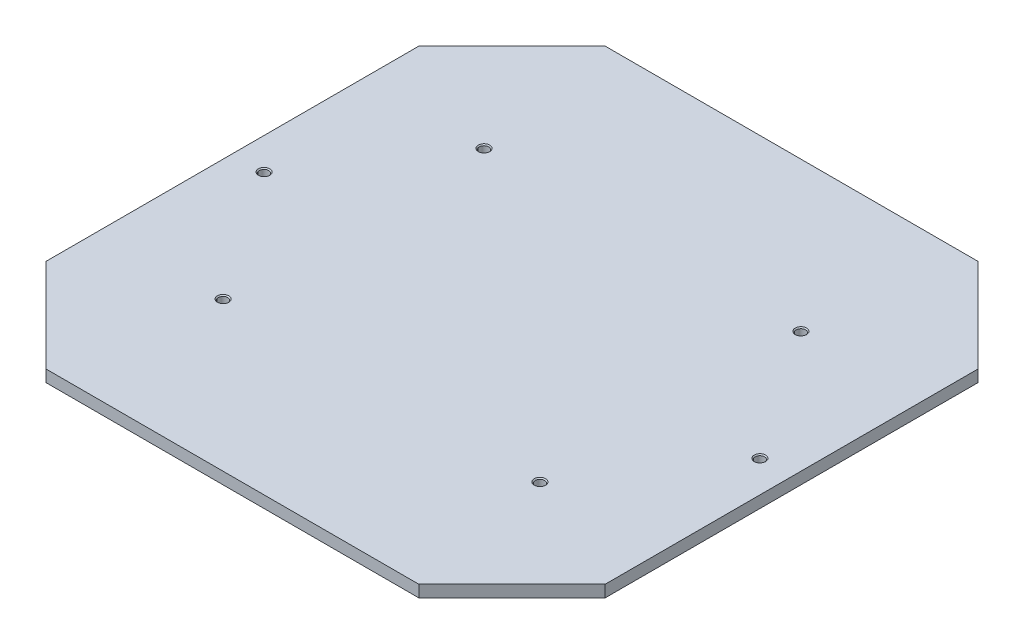
ISO-10303-21;
HEADER;
FILE_DESCRIPTION(('STEP AP214'),'2;1');
FILE_NAME('part.step','',(''),(''),'','','');
FILE_SCHEMA(('AUTOMOTIVE_DESIGN { 1 0 10303 214 1 1 1 1 }'));
ENDSEC;
DATA;
#1=APPLICATION_CONTEXT('core data for automotive mechanical design processes');
#2=APPLICATION_PROTOCOL_DEFINITION('international standard','automotive_design',2000,#1);
#3=PRODUCT_CONTEXT('',#1,'mechanical');
#4=PRODUCT('Part','Part','',(#3));
#5=PRODUCT_RELATED_PRODUCT_CATEGORY('part','',(#4));
#6=PRODUCT_DEFINITION_FORMATION('','',#4);
#7=PRODUCT_DEFINITION_CONTEXT('part definition',#1,'design');
#8=PRODUCT_DEFINITION('design','',#6,#7);
#9=PRODUCT_DEFINITION_SHAPE('','',#8);
#10=(LENGTH_UNIT() NAMED_UNIT(*) SI_UNIT(.MILLI.,.METRE.));
#11=(NAMED_UNIT(*) PLANE_ANGLE_UNIT() SI_UNIT($,.RADIAN.));
#12=(NAMED_UNIT(*) SI_UNIT($,.STERADIAN.) SOLID_ANGLE_UNIT());
#13=UNCERTAINTY_MEASURE_WITH_UNIT(LENGTH_MEASURE(1.E-05),#10,'distance_accuracy_value','');
#14=(GEOMETRIC_REPRESENTATION_CONTEXT(3) GLOBAL_UNCERTAINTY_ASSIGNED_CONTEXT((#13)) GLOBAL_UNIT_ASSIGNED_CONTEXT((#10,
#11,#12)) REPRESENTATION_CONTEXT('',''));
#15=CARTESIAN_POINT('',(0.,0.,0.));
#16=DIRECTION('',(0.,0.,1.));
#17=DIRECTION('',(1.,0.,0.));
#18=AXIS2_PLACEMENT_3D('',#15,#16,#17);
#19=CARTESIAN_POINT('',(75.,3.175,75.));
#20=DIRECTION('',(-1.,0.,0.));
#21=DIRECTION('',(0.,0.,1.));
#22=AXIS2_PLACEMENT_3D('',#19,#20,#21);
#23=PLANE('',#22);
#24=DIRECTION('',(0.,0.,-1.));
#25=VECTOR('',#24,1.);
#26=CARTESIAN_POINT('',(75.,0.,75.));
#27=LINE('',#26,#25);
#28=CARTESIAN_POINT('',(75.,0.,50.));
#29=VERTEX_POINT('',#28);
#30=CARTESIAN_POINT('',(75.,0.,-49.9999999999999));
#31=VERTEX_POINT('',#30);
#32=EDGE_CURVE('E130',#29,#31,#27,.T.);
#33=ORIENTED_EDGE('',*,*,#32,.T.);
#34=DIRECTION('',(0.,1.,0.));
#35=VECTOR('',#34,1.);
#36=CARTESIAN_POINT('',(75.,3.175,-49.9999999999999));
#37=LINE('',#36,#35);
#38=CARTESIAN_POINT('',(75.,3.175,-49.9999999999999));
#39=VERTEX_POINT('',#38);
#40=EDGE_CURVE('E152',#31,#39,#37,.T.);
#41=ORIENTED_EDGE('',*,*,#40,.T.);
#42=DIRECTION('',(0.,0.,-1.));
#43=VECTOR('',#42,1.);
#44=CARTESIAN_POINT('',(75.,3.175,75.));
#45=LINE('',#44,#43);
#46=CARTESIAN_POINT('',(75.,3.175,50.));
#47=VERTEX_POINT('',#46);
#48=EDGE_CURVE('E128',#47,#39,#45,.T.);
#49=ORIENTED_EDGE('',*,*,#48,.F.);
#50=DIRECTION('',(0.,-1.,0.));
#51=VECTOR('',#50,1.);
#52=CARTESIAN_POINT('',(75.,3.175,50.));
#53=LINE('',#52,#51);
#54=EDGE_CURVE('E149',#47,#29,#53,.T.);
#55=ORIENTED_EDGE('',*,*,#54,.T.);
#56=EDGE_LOOP('',(#33,#41,#49,#55));
#57=FACE_BOUND('',#56,.T.);
#58=ADVANCED_FACE('F33',(#57),#23,.F.);
#59=CARTESIAN_POINT('',(-75.,3.175,-75.));
#60=DIRECTION('',(0.,0.,1.));
#61=DIRECTION('',(1.,0.,0.));
#62=AXIS2_PLACEMENT_3D('',#59,#60,#61);
#63=PLANE('',#62);
#64=DIRECTION('',(-1.,0.,0.));
#65=VECTOR('',#64,1.);
#66=CARTESIAN_POINT('',(-75.,0.,-75.));
#67=LINE('',#66,#65);
#68=CARTESIAN_POINT('',(50.,0.,-75.));
#69=VERTEX_POINT('',#68);
#70=CARTESIAN_POINT('',(-50.,0.,-75.));
#71=VERTEX_POINT('',#70);
#72=EDGE_CURVE('E126',#69,#71,#67,.T.);
#73=ORIENTED_EDGE('',*,*,#72,.T.);
#74=DIRECTION('',(0.,1.,0.));
#75=VECTOR('',#74,1.);
#76=CARTESIAN_POINT('',(-50.,3.175,-75.));
#77=LINE('',#76,#75);
#78=CARTESIAN_POINT('',(-50.,3.175,-75.));
#79=VERTEX_POINT('',#78);
#80=EDGE_CURVE('E104',#71,#79,#77,.T.);
#81=ORIENTED_EDGE('',*,*,#80,.T.);
#82=DIRECTION('',(-1.,0.,0.));
#83=VECTOR('',#82,1.);
#84=CARTESIAN_POINT('',(-75.,3.175,-75.));
#85=LINE('',#84,#83);
#86=CARTESIAN_POINT('',(50.,3.175,-75.));
#87=VERTEX_POINT('',#86);
#88=EDGE_CURVE('E166',#87,#79,#85,.T.);
#89=ORIENTED_EDGE('',*,*,#88,.F.);
#90=DIRECTION('',(0.,-1.,0.));
#91=VECTOR('',#90,1.);
#92=CARTESIAN_POINT('',(50.,3.175,-75.));
#93=LINE('',#92,#91);
#94=EDGE_CURVE('E109',#87,#69,#93,.T.);
#95=ORIENTED_EDGE('',*,*,#94,.T.);
#96=EDGE_LOOP('',(#73,#81,#89,#95));
#97=FACE_BOUND('',#96,.T.);
#98=ADVANCED_FACE('F171',(#97),#63,.F.);
#99=CARTESIAN_POINT('',(-75.,3.175,75.));
#100=DIRECTION('',(1.,0.,0.));
#101=DIRECTION('',(0.,0.,-1.));
#102=AXIS2_PLACEMENT_3D('',#99,#100,#101);
#103=PLANE('',#102);
#104=DIRECTION('',(0.,0.,1.));
#105=VECTOR('',#104,1.);
#106=CARTESIAN_POINT('',(-75.,3.175,75.));
#107=LINE('',#106,#105);
#108=CARTESIAN_POINT('',(-75.,3.175,-50.));
#109=VERTEX_POINT('',#108);
#110=CARTESIAN_POINT('',(-75.,3.175,49.9999999999999));
#111=VERTEX_POINT('',#110);
#112=EDGE_CURVE('E118',#109,#111,#107,.T.);
#113=ORIENTED_EDGE('',*,*,#112,.F.);
#114=DIRECTION('',(0.,-1.,0.));
#115=VECTOR('',#114,1.);
#116=CARTESIAN_POINT('',(-75.,3.175,-50.));
#117=LINE('',#116,#115);
#118=CARTESIAN_POINT('',(-75.,0.,-50.));
#119=VERTEX_POINT('',#118);
#120=EDGE_CURVE('E103',#109,#119,#117,.T.);
#121=ORIENTED_EDGE('',*,*,#120,.T.);
#122=DIRECTION('',(0.,0.,1.));
#123=VECTOR('',#122,1.);
#124=CARTESIAN_POINT('',(-75.,0.,75.));
#125=LINE('',#124,#123);
#126=CARTESIAN_POINT('',(-75.,0.,49.9999999999999));
#127=VERTEX_POINT('',#126);
#128=EDGE_CURVE('E116',#119,#127,#125,.T.);
#129=ORIENTED_EDGE('',*,*,#128,.T.);
#130=DIRECTION('',(0.,1.,0.));
#131=VECTOR('',#130,1.);
#132=CARTESIAN_POINT('',(-75.,3.175,49.9999999999999));
#133=LINE('',#132,#131);
#134=EDGE_CURVE('E120',#127,#111,#133,.T.);
#135=ORIENTED_EDGE('',*,*,#134,.T.);
#136=EDGE_LOOP('',(#113,#121,#129,#135));
#137=FACE_BOUND('',#136,.T.);
#138=ADVANCED_FACE('F115',(#137),#103,.F.);
#139=CARTESIAN_POINT('',(-75.,3.175,75.));
#140=DIRECTION('',(0.,0.,-1.));
#141=DIRECTION('',(-1.,0.,0.));
#142=AXIS2_PLACEMENT_3D('',#139,#140,#141);
#143=PLANE('',#142);
#144=DIRECTION('',(1.,0.,0.));
#145=VECTOR('',#144,1.);
#146=CARTESIAN_POINT('',(-75.,3.175,75.));
#147=LINE('',#146,#145);
#148=CARTESIAN_POINT('',(-50.,3.175,75.));
#149=VERTEX_POINT('',#148);
#150=CARTESIAN_POINT('',(49.9999999999999,3.175,75.));
#151=VERTEX_POINT('',#150);
#152=EDGE_CURVE('E134',#149,#151,#147,.T.);
#153=ORIENTED_EDGE('',*,*,#152,.F.);
#154=DIRECTION('',(0.,-1.,0.));
#155=VECTOR('',#154,1.);
#156=CARTESIAN_POINT('',(-50.,3.175,75.));
#157=LINE('',#156,#155);
#158=CARTESIAN_POINT('',(-50.,0.,75.));
#159=VERTEX_POINT('',#158);
#160=EDGE_CURVE('E11',#149,#159,#157,.T.);
#161=ORIENTED_EDGE('',*,*,#160,.T.);
#162=DIRECTION('',(1.,0.,0.));
#163=VECTOR('',#162,1.);
#164=CARTESIAN_POINT('',(-75.,0.,75.));
#165=LINE('',#164,#163);
#166=CARTESIAN_POINT('',(49.9999999999999,0.,75.));
#167=VERTEX_POINT('',#166);
#168=EDGE_CURVE('E125',#159,#167,#165,.T.);
#169=ORIENTED_EDGE('',*,*,#168,.T.);
#170=DIRECTION('',(0.,1.,0.));
#171=VECTOR('',#170,1.);
#172=CARTESIAN_POINT('',(49.9999999999999,3.175,75.));
#173=LINE('',#172,#171);
#174=EDGE_CURVE('E41',#167,#151,#173,.T.);
#175=ORIENTED_EDGE('',*,*,#174,.T.);
#176=EDGE_LOOP('',(#153,#161,#169,#175));
#177=FACE_BOUND('',#176,.T.);
#178=ADVANCED_FACE('F235',(#177),#143,.F.);
#179=CARTESIAN_POINT('',(0.,3.175,0.));
#180=DIRECTION('',(0.,-1.,0.));
#181=DIRECTION('',(0.,0.,-1.));
#182=AXIS2_PLACEMENT_3D('',#179,#180,#181);
#183=PLANE('',#182);
#184=CARTESIAN_POINT('',(-42.5,3.175,-35.));
#185=DIRECTION('',(0.,1.,0.));
#186=DIRECTION('',(0.,0.,1.));
#187=AXIS2_PLACEMENT_3D('',#184,#185,#186);
#188=CIRCLE('',#187,1.525);
#189=CARTESIAN_POINT('',(-42.5,3.175,-33.475));
#190=VERTEX_POINT('',#189);
#191=EDGE_CURVE('E227',#190,#190,#188,.T.);
#192=ORIENTED_EDGE('',*,*,#191,.F.);
#193=EDGE_LOOP('',(#192));
#194=FACE_BOUND('',#193,.T.);
#195=CARTESIAN_POINT('',(42.5000000000001,3.175,-35.));
#196=DIRECTION('',(0.,1.,0.));
#197=DIRECTION('',(0.,0.,1.));
#198=AXIS2_PLACEMENT_3D('',#195,#196,#197);
#199=CIRCLE('',#198,1.525);
#200=CARTESIAN_POINT('',(42.5000000000001,3.175,-33.475));
#201=VERTEX_POINT('',#200);
#202=EDGE_CURVE('E218',#201,#201,#199,.T.);
#203=ORIENTED_EDGE('',*,*,#202,.F.);
#204=EDGE_LOOP('',(#203));
#205=FACE_BOUND('',#204,.T.);
#206=CARTESIAN_POINT('',(-42.5,3.175,35.));
#207=DIRECTION('',(0.,1.,0.));
#208=DIRECTION('',(0.,0.,1.));
#209=AXIS2_PLACEMENT_3D('',#206,#207,#208);
#210=CIRCLE('',#209,1.525);
#211=CARTESIAN_POINT('',(-42.5,3.175,36.525));
#212=VERTEX_POINT('',#211);
#213=EDGE_CURVE('E209',#212,#212,#210,.T.);
#214=ORIENTED_EDGE('',*,*,#213,.F.);
#215=EDGE_LOOP('',(#214));
#216=FACE_BOUND('',#215,.T.);
#217=CARTESIAN_POINT('',(42.5000000000001,3.175,35.));
#218=DIRECTION('',(0.,1.,0.));
#219=DIRECTION('',(0.,0.,1.));
#220=AXIS2_PLACEMENT_3D('',#217,#218,#219);
#221=CIRCLE('',#220,1.525);
#222=CARTESIAN_POINT('',(42.5000000000001,3.175,36.525));
#223=VERTEX_POINT('',#222);
#224=EDGE_CURVE('E200',#223,#223,#221,.T.);
#225=ORIENTED_EDGE('',*,*,#224,.F.);
#226=EDGE_LOOP('',(#225));
#227=FACE_BOUND('',#226,.T.);
#228=CARTESIAN_POINT('',(-66.5,3.175,0.));
#229=DIRECTION('',(0.,1.,0.));
#230=DIRECTION('',(0.,0.,1.));
#231=AXIS2_PLACEMENT_3D('',#228,#229,#230);
#232=CIRCLE('',#231,1.525);
#233=CARTESIAN_POINT('',(-66.5,3.175,1.525));
#234=VERTEX_POINT('',#233);
#235=EDGE_CURVE('E191',#234,#234,#232,.T.);
#236=ORIENTED_EDGE('',*,*,#235,.F.);
#237=EDGE_LOOP('',(#236));
#238=FACE_BOUND('',#237,.T.);
#239=CARTESIAN_POINT('',(66.5000000000001,3.175,0.));
#240=DIRECTION('',(0.,1.,0.));
#241=DIRECTION('',(0.,0.,1.));
#242=AXIS2_PLACEMENT_3D('',#239,#240,#241);
#243=CIRCLE('',#242,1.525);
#244=CARTESIAN_POINT('',(66.5000000000001,3.175,1.525));
#245=VERTEX_POINT('',#244);
#246=EDGE_CURVE('E182',#245,#245,#243,.T.);
#247=ORIENTED_EDGE('',*,*,#246,.F.);
#248=EDGE_LOOP('',(#247));
#249=FACE_BOUND('',#248,.T.);
#250=ORIENTED_EDGE('',*,*,#88,.T.);
#251=DIRECTION('',(0.707106781186549,0.,-0.707106781186546));
#252=VECTOR('',#251,1.);
#253=CARTESIAN_POINT('',(-75.,3.175,-50.));
#254=LINE('',#253,#252);
#255=EDGE_CURVE('E147',#79,#109,#254,.F.);
#256=ORIENTED_EDGE('',*,*,#255,.T.);
#257=ORIENTED_EDGE('',*,*,#112,.T.);
#258=DIRECTION('',(-0.707106781186546,0.,-0.707106781186549));
#259=VECTOR('',#258,1.);
#260=CARTESIAN_POINT('',(-50.,3.175,75.));
#261=LINE('',#260,#259);
#262=EDGE_CURVE('E54',#111,#149,#261,.F.);
#263=ORIENTED_EDGE('',*,*,#262,.T.);
#264=ORIENTED_EDGE('',*,*,#152,.T.);
#265=DIRECTION('',(-0.707106781186549,0.,0.707106781186546));
#266=VECTOR('',#265,1.);
#267=CARTESIAN_POINT('',(75.,3.175,50.));
#268=LINE('',#267,#266);
#269=EDGE_CURVE('E142',#151,#47,#268,.F.);
#270=ORIENTED_EDGE('',*,*,#269,.T.);
#271=ORIENTED_EDGE('',*,*,#48,.T.);
#272=DIRECTION('',(0.707106781186546,0.,0.707106781186549));
#273=VECTOR('',#272,1.);
#274=CARTESIAN_POINT('',(50.,3.175,-75.));
#275=LINE('',#274,#273);
#276=EDGE_CURVE('E145',#39,#87,#275,.F.);
#277=ORIENTED_EDGE('',*,*,#276,.T.);
#278=EDGE_LOOP('',(#250,#256,#257,#263,#264,#270,#271,#277));
#279=FACE_BOUND('',#278,.T.);
#280=ADVANCED_FACE('F163',(#194,#205,#216,#227,#238,#249,#279),#183,.F.);
#281=CARTESIAN_POINT('',(0.,0.,0.));
#282=DIRECTION('',(0.,-1.,0.));
#283=DIRECTION('',(0.,0.,-1.));
#284=AXIS2_PLACEMENT_3D('',#281,#282,#283);
#285=PLANE('',#284);
#286=CARTESIAN_POINT('',(-42.5,0.,-35.));
#287=DIRECTION('',(0.,1.,0.));
#288=DIRECTION('',(0.,0.,1.));
#289=AXIS2_PLACEMENT_3D('',#286,#287,#288);
#290=CIRCLE('',#289,1.25);
#291=CARTESIAN_POINT('',(-42.5,0.,-33.75));
#292=VERTEX_POINT('',#291);
#293=EDGE_CURVE('E221',#292,#292,#290,.T.);
#294=ORIENTED_EDGE('',*,*,#293,.T.);
#295=EDGE_LOOP('',(#294));
#296=FACE_BOUND('',#295,.T.);
#297=CARTESIAN_POINT('',(42.5000000000001,0.,-35.));
#298=DIRECTION('',(0.,1.,0.));
#299=DIRECTION('',(0.,0.,1.));
#300=AXIS2_PLACEMENT_3D('',#297,#298,#299);
#301=CIRCLE('',#300,1.25);
#302=CARTESIAN_POINT('',(42.5000000000001,0.,-33.75));
#303=VERTEX_POINT('',#302);
#304=EDGE_CURVE('E212',#303,#303,#301,.T.);
#305=ORIENTED_EDGE('',*,*,#304,.T.);
#306=EDGE_LOOP('',(#305));
#307=FACE_BOUND('',#306,.T.);
#308=CARTESIAN_POINT('',(-42.5,0.,35.));
#309=DIRECTION('',(0.,1.,0.));
#310=DIRECTION('',(0.,0.,1.));
#311=AXIS2_PLACEMENT_3D('',#308,#309,#310);
#312=CIRCLE('',#311,1.25);
#313=CARTESIAN_POINT('',(-42.5,0.,36.25));
#314=VERTEX_POINT('',#313);
#315=EDGE_CURVE('E203',#314,#314,#312,.T.);
#316=ORIENTED_EDGE('',*,*,#315,.T.);
#317=EDGE_LOOP('',(#316));
#318=FACE_BOUND('',#317,.T.);
#319=CARTESIAN_POINT('',(42.5000000000001,0.,35.));
#320=DIRECTION('',(0.,1.,0.));
#321=DIRECTION('',(0.,0.,1.));
#322=AXIS2_PLACEMENT_3D('',#319,#320,#321);
#323=CIRCLE('',#322,1.25);
#324=CARTESIAN_POINT('',(42.5000000000001,0.,36.25));
#325=VERTEX_POINT('',#324);
#326=EDGE_CURVE('E194',#325,#325,#323,.T.);
#327=ORIENTED_EDGE('',*,*,#326,.T.);
#328=EDGE_LOOP('',(#327));
#329=FACE_BOUND('',#328,.T.);
#330=CARTESIAN_POINT('',(-66.5,0.,0.));
#331=DIRECTION('',(0.,1.,0.));
#332=DIRECTION('',(0.,0.,1.));
#333=AXIS2_PLACEMENT_3D('',#330,#331,#332);
#334=CIRCLE('',#333,1.25);
#335=CARTESIAN_POINT('',(-66.5,0.,1.25));
#336=VERTEX_POINT('',#335);
#337=EDGE_CURVE('E185',#336,#336,#334,.T.);
#338=ORIENTED_EDGE('',*,*,#337,.T.);
#339=EDGE_LOOP('',(#338));
#340=FACE_BOUND('',#339,.T.);
#341=CARTESIAN_POINT('',(66.5000000000001,0.,0.));
#342=DIRECTION('',(0.,1.,0.));
#343=DIRECTION('',(0.,0.,1.));
#344=AXIS2_PLACEMENT_3D('',#341,#342,#343);
#345=CIRCLE('',#344,1.25);
#346=CARTESIAN_POINT('',(66.5000000000001,0.,1.25));
#347=VERTEX_POINT('',#346);
#348=EDGE_CURVE('E172',#347,#347,#345,.T.);
#349=ORIENTED_EDGE('',*,*,#348,.T.);
#350=EDGE_LOOP('',(#349));
#351=FACE_BOUND('',#350,.T.);
#352=ORIENTED_EDGE('',*,*,#128,.F.);
#353=DIRECTION('',(-0.707106781186549,0.,0.707106781186546));
#354=VECTOR('',#353,1.);
#355=CARTESIAN_POINT('',(-62.4999999999999,0.,-62.5000000000001));
#356=LINE('',#355,#354);
#357=EDGE_CURVE('E99',#119,#71,#356,.F.);
#358=ORIENTED_EDGE('',*,*,#357,.T.);
#359=ORIENTED_EDGE('',*,*,#72,.F.);
#360=DIRECTION('',(-0.707106781186546,0.,-0.707106781186549));
#361=VECTOR('',#360,1.);
#362=CARTESIAN_POINT('',(62.5000000000001,0.,-62.4999999999999));
#363=LINE('',#362,#361);
#364=EDGE_CURVE('E110',#69,#31,#363,.F.);
#365=ORIENTED_EDGE('',*,*,#364,.T.);
#366=ORIENTED_EDGE('',*,*,#32,.F.);
#367=DIRECTION('',(0.707106781186549,0.,-0.707106781186546));
#368=VECTOR('',#367,1.);
#369=CARTESIAN_POINT('',(62.4999999999999,0.,62.5000000000001));
#370=LINE('',#369,#368);
#371=EDGE_CURVE('E119',#29,#167,#370,.F.);
#372=ORIENTED_EDGE('',*,*,#371,.T.);
#373=ORIENTED_EDGE('',*,*,#168,.F.);
#374=DIRECTION('',(0.707106781186546,0.,0.707106781186549));
#375=VECTOR('',#374,1.);
#376=CARTESIAN_POINT('',(-62.5000000000001,0.,62.4999999999999));
#377=LINE('',#376,#375);
#378=EDGE_CURVE('E124',#159,#127,#377,.F.);
#379=ORIENTED_EDGE('',*,*,#378,.T.);
#380=EDGE_LOOP('',(#352,#358,#359,#365,#366,#372,#373,#379));
#381=FACE_BOUND('',#380,.T.);
#382=ADVANCED_FACE('F122',(#296,#307,#318,#329,#340,#351,#381),#285,.T.);
#383=CARTESIAN_POINT('',(-75.,3.175,-50.));
#384=DIRECTION('',(0.707106781186546,0.,0.707106781186549));
#385=DIRECTION('',(0.,-1.,0.));
#386=AXIS2_PLACEMENT_3D('',#383,#384,#385);
#387=PLANE('',#386);
#388=ORIENTED_EDGE('',*,*,#255,.F.);
#389=ORIENTED_EDGE('',*,*,#80,.F.);
#390=ORIENTED_EDGE('',*,*,#357,.F.);
#391=ORIENTED_EDGE('',*,*,#120,.F.);
#392=EDGE_LOOP('',(#388,#389,#390,#391));
#393=FACE_BOUND('',#392,.T.);
#394=ADVANCED_FACE('F102',(#393),#387,.F.);
#395=CARTESIAN_POINT('',(50.,3.175,-75.));
#396=DIRECTION('',(-0.707106781186549,0.,0.707106781186546));
#397=DIRECTION('',(0.,-1.,0.));
#398=AXIS2_PLACEMENT_3D('',#395,#396,#397);
#399=PLANE('',#398);
#400=ORIENTED_EDGE('',*,*,#276,.F.);
#401=ORIENTED_EDGE('',*,*,#40,.F.);
#402=ORIENTED_EDGE('',*,*,#364,.F.);
#403=ORIENTED_EDGE('',*,*,#94,.F.);
#404=EDGE_LOOP('',(#400,#401,#402,#403));
#405=FACE_BOUND('',#404,.T.);
#406=ADVANCED_FACE('F169',(#405),#399,.F.);
#407=CARTESIAN_POINT('',(-50.,3.175,75.));
#408=DIRECTION('',(0.707106781186549,0.,-0.707106781186546));
#409=DIRECTION('',(0.,-1.,0.));
#410=AXIS2_PLACEMENT_3D('',#407,#408,#409);
#411=PLANE('',#410);
#412=ORIENTED_EDGE('',*,*,#262,.F.);
#413=ORIENTED_EDGE('',*,*,#134,.F.);
#414=ORIENTED_EDGE('',*,*,#378,.F.);
#415=ORIENTED_EDGE('',*,*,#160,.F.);
#416=EDGE_LOOP('',(#412,#413,#414,#415));
#417=FACE_BOUND('',#416,.T.);
#418=ADVANCED_FACE('F274',(#417),#411,.F.);
#419=CARTESIAN_POINT('',(75.,3.175,50.));
#420=DIRECTION('',(-0.707106781186546,0.,-0.707106781186549));
#421=DIRECTION('',(0.,-1.,0.));
#422=AXIS2_PLACEMENT_3D('',#419,#420,#421);
#423=PLANE('',#422);
#424=ORIENTED_EDGE('',*,*,#269,.F.);
#425=ORIENTED_EDGE('',*,*,#174,.F.);
#426=ORIENTED_EDGE('',*,*,#371,.F.);
#427=ORIENTED_EDGE('',*,*,#54,.F.);
#428=EDGE_LOOP('',(#424,#425,#426,#427));
#429=FACE_BOUND('',#428,.T.);
#430=ADVANCED_FACE('F35',(#429),#423,.F.);
#431=CARTESIAN_POINT('',(66.5000000000001,3.175,0.));
#432=DIRECTION('',(0.,1.,0.));
#433=DIRECTION('',(0.,0.,1.));
#434=AXIS2_PLACEMENT_3D('',#431,#432,#433);
#435=CYLINDRICAL_SURFACE('',#434,1.25);
#436=ORIENTED_EDGE('',*,*,#348,.F.);
#437=EDGE_LOOP('',(#436));
#438=FACE_BOUND('',#437,.T.);
#439=CARTESIAN_POINT('',(66.5000000000001,2.9,0.));
#440=DIRECTION('',(0.,1.,0.));
#441=DIRECTION('',(0.,0.,1.));
#442=AXIS2_PLACEMENT_3D('',#439,#440,#441);
#443=CIRCLE('',#442,1.25);
#444=CARTESIAN_POINT('',(66.5000000000001,2.9,1.25));
#445=VERTEX_POINT('',#444);
#446=EDGE_CURVE('E174',#445,#445,#443,.T.);
#447=ORIENTED_EDGE('',*,*,#446,.T.);
#448=EDGE_LOOP('',(#447));
#449=FACE_BOUND('',#448,.T.);
#450=ADVANCED_FACE('F250',(#438,#449),#435,.F.);
#451=CARTESIAN_POINT('',(66.5000000000001,3.175,0.));
#452=DIRECTION('',(0.,1.,0.));
#453=DIRECTION('',(0.,0.,1.));
#454=AXIS2_PLACEMENT_3D('',#451,#452,#453);
#455=CONICAL_SURFACE('',#454,1.525,0.785398163397442);
#456=ORIENTED_EDGE('',*,*,#446,.F.);
#457=EDGE_LOOP('',(#456));
#458=FACE_BOUND('',#457,.T.);
#459=ORIENTED_EDGE('',*,*,#246,.T.);
#460=EDGE_LOOP('',(#459));
#461=FACE_BOUND('',#460,.T.);
#462=ADVANCED_FACE('F247',(#458,#461),#455,.F.);
#463=CARTESIAN_POINT('',(-66.5,3.175,0.));
#464=DIRECTION('',(0.,1.,0.));
#465=DIRECTION('',(0.,0.,1.));
#466=AXIS2_PLACEMENT_3D('',#463,#464,#465);
#467=CYLINDRICAL_SURFACE('',#466,1.25);
#468=ORIENTED_EDGE('',*,*,#337,.F.);
#469=EDGE_LOOP('',(#468));
#470=FACE_BOUND('',#469,.T.);
#471=CARTESIAN_POINT('',(-66.5,2.9,0.));
#472=DIRECTION('',(0.,1.,0.));
#473=DIRECTION('',(0.,0.,1.));
#474=AXIS2_PLACEMENT_3D('',#471,#472,#473);
#475=CIRCLE('',#474,1.25);
#476=CARTESIAN_POINT('',(-66.5,2.9,1.25));
#477=VERTEX_POINT('',#476);
#478=EDGE_CURVE('E188',#477,#477,#475,.T.);
#479=ORIENTED_EDGE('',*,*,#478,.T.);
#480=EDGE_LOOP('',(#479));
#481=FACE_BOUND('',#480,.T.);
#482=ADVANCED_FACE('F249',(#470,#481),#467,.F.);
#483=CARTESIAN_POINT('',(-66.5,3.175,0.));
#484=DIRECTION('',(0.,1.,0.));
#485=DIRECTION('',(0.,0.,1.));
#486=AXIS2_PLACEMENT_3D('',#483,#484,#485);
#487=CONICAL_SURFACE('',#486,1.525,0.785398163397442);
#488=ORIENTED_EDGE('',*,*,#478,.F.);
#489=EDGE_LOOP('',(#488));
#490=FACE_BOUND('',#489,.T.);
#491=ORIENTED_EDGE('',*,*,#235,.T.);
#492=EDGE_LOOP('',(#491));
#493=FACE_BOUND('',#492,.T.);
#494=ADVANCED_FACE('F257',(#490,#493),#487,.F.);
#495=CARTESIAN_POINT('',(42.5000000000001,3.175,35.));
#496=DIRECTION('',(0.,1.,0.));
#497=DIRECTION('',(0.,0.,1.));
#498=AXIS2_PLACEMENT_3D('',#495,#496,#497);
#499=CYLINDRICAL_SURFACE('',#498,1.25);
#500=ORIENTED_EDGE('',*,*,#326,.F.);
#501=EDGE_LOOP('',(#500));
#502=FACE_BOUND('',#501,.T.);
#503=CARTESIAN_POINT('',(42.5000000000001,2.9,35.));
#504=DIRECTION('',(0.,1.,0.));
#505=DIRECTION('',(0.,0.,1.));
#506=AXIS2_PLACEMENT_3D('',#503,#504,#505);
#507=CIRCLE('',#506,1.25);
#508=CARTESIAN_POINT('',(42.5000000000001,2.9,36.25));
#509=VERTEX_POINT('',#508);
#510=EDGE_CURVE('E197',#509,#509,#507,.T.);
#511=ORIENTED_EDGE('',*,*,#510,.T.);
#512=EDGE_LOOP('',(#511));
#513=FACE_BOUND('',#512,.T.);
#514=ADVANCED_FACE('F309',(#502,#513),#499,.F.);
#515=CARTESIAN_POINT('',(42.5000000000001,3.175,35.));
#516=DIRECTION('',(0.,1.,0.));
#517=DIRECTION('',(0.,0.,1.));
#518=AXIS2_PLACEMENT_3D('',#515,#516,#517);
#519=CONICAL_SURFACE('',#518,1.525,0.785398163397442);
#520=ORIENTED_EDGE('',*,*,#510,.F.);
#521=EDGE_LOOP('',(#520));
#522=FACE_BOUND('',#521,.T.);
#523=ORIENTED_EDGE('',*,*,#224,.T.);
#524=EDGE_LOOP('',(#523));
#525=FACE_BOUND('',#524,.T.);
#526=ADVANCED_FACE('F314',(#522,#525),#519,.F.);
#527=CARTESIAN_POINT('',(-42.5,3.175,35.));
#528=DIRECTION('',(0.,1.,0.));
#529=DIRECTION('',(0.,0.,1.));
#530=AXIS2_PLACEMENT_3D('',#527,#528,#529);
#531=CYLINDRICAL_SURFACE('',#530,1.25);
#532=ORIENTED_EDGE('',*,*,#315,.F.);
#533=EDGE_LOOP('',(#532));
#534=FACE_BOUND('',#533,.T.);
#535=CARTESIAN_POINT('',(-42.5,2.9,35.));
#536=DIRECTION('',(0.,1.,0.));
#537=DIRECTION('',(0.,0.,1.));
#538=AXIS2_PLACEMENT_3D('',#535,#536,#537);
#539=CIRCLE('',#538,1.25);
#540=CARTESIAN_POINT('',(-42.5,2.9,36.25));
#541=VERTEX_POINT('',#540);
#542=EDGE_CURVE('E206',#541,#541,#539,.T.);
#543=ORIENTED_EDGE('',*,*,#542,.T.);
#544=EDGE_LOOP('',(#543));
#545=FACE_BOUND('',#544,.T.);
#546=ADVANCED_FACE('F320',(#534,#545),#531,.F.);
#547=CARTESIAN_POINT('',(-42.5,3.175,35.));
#548=DIRECTION('',(0.,1.,0.));
#549=DIRECTION('',(0.,0.,1.));
#550=AXIS2_PLACEMENT_3D('',#547,#548,#549);
#551=CONICAL_SURFACE('',#550,1.525,0.785398163397442);
#552=ORIENTED_EDGE('',*,*,#542,.F.);
#553=EDGE_LOOP('',(#552));
#554=FACE_BOUND('',#553,.T.);
#555=ORIENTED_EDGE('',*,*,#213,.T.);
#556=EDGE_LOOP('',(#555));
#557=FACE_BOUND('',#556,.T.);
#558=ADVANCED_FACE('F324',(#554,#557),#551,.F.);
#559=CARTESIAN_POINT('',(42.5000000000001,3.175,-35.));
#560=DIRECTION('',(0.,1.,0.));
#561=DIRECTION('',(0.,0.,1.));
#562=AXIS2_PLACEMENT_3D('',#559,#560,#561);
#563=CYLINDRICAL_SURFACE('',#562,1.25);
#564=ORIENTED_EDGE('',*,*,#304,.F.);
#565=EDGE_LOOP('',(#564));
#566=FACE_BOUND('',#565,.T.);
#567=CARTESIAN_POINT('',(42.5000000000001,2.9,-35.));
#568=DIRECTION('',(0.,1.,0.));
#569=DIRECTION('',(0.,0.,1.));
#570=AXIS2_PLACEMENT_3D('',#567,#568,#569);
#571=CIRCLE('',#570,1.25);
#572=CARTESIAN_POINT('',(42.5000000000001,2.9,-33.75));
#573=VERTEX_POINT('',#572);
#574=EDGE_CURVE('E215',#573,#573,#571,.T.);
#575=ORIENTED_EDGE('',*,*,#574,.T.);
#576=EDGE_LOOP('',(#575));
#577=FACE_BOUND('',#576,.T.);
#578=ADVANCED_FACE('F328',(#566,#577),#563,.F.);
#579=CARTESIAN_POINT('',(42.5000000000001,3.175,-35.));
#580=DIRECTION('',(0.,1.,0.));
#581=DIRECTION('',(0.,0.,1.));
#582=AXIS2_PLACEMENT_3D('',#579,#580,#581);
#583=CONICAL_SURFACE('',#582,1.525,0.785398163397442);
#584=ORIENTED_EDGE('',*,*,#574,.F.);
#585=EDGE_LOOP('',(#584));
#586=FACE_BOUND('',#585,.T.);
#587=ORIENTED_EDGE('',*,*,#202,.T.);
#588=EDGE_LOOP('',(#587));
#589=FACE_BOUND('',#588,.T.);
#590=ADVANCED_FACE('F332',(#586,#589),#583,.F.);
#591=CARTESIAN_POINT('',(-42.5,3.175,-35.));
#592=DIRECTION('',(0.,1.,0.));
#593=DIRECTION('',(0.,0.,1.));
#594=AXIS2_PLACEMENT_3D('',#591,#592,#593);
#595=CYLINDRICAL_SURFACE('',#594,1.25);
#596=ORIENTED_EDGE('',*,*,#293,.F.);
#597=EDGE_LOOP('',(#596));
#598=FACE_BOUND('',#597,.T.);
#599=CARTESIAN_POINT('',(-42.5,2.9,-35.));
#600=DIRECTION('',(0.,1.,0.));
#601=DIRECTION('',(0.,0.,1.));
#602=AXIS2_PLACEMENT_3D('',#599,#600,#601);
#603=CIRCLE('',#602,1.25);
#604=CARTESIAN_POINT('',(-42.5,2.9,-33.75));
#605=VERTEX_POINT('',#604);
#606=EDGE_CURVE('E224',#605,#605,#603,.T.);
#607=ORIENTED_EDGE('',*,*,#606,.T.);
#608=EDGE_LOOP('',(#607));
#609=FACE_BOUND('',#608,.T.);
#610=ADVANCED_FACE('F336',(#598,#609),#595,.F.);
#611=CARTESIAN_POINT('',(-42.5,3.175,-35.));
#612=DIRECTION('',(0.,1.,0.));
#613=DIRECTION('',(0.,0.,1.));
#614=AXIS2_PLACEMENT_3D('',#611,#612,#613);
#615=CONICAL_SURFACE('',#614,1.525,0.785398163397442);
#616=ORIENTED_EDGE('',*,*,#606,.F.);
#617=EDGE_LOOP('',(#616));
#618=FACE_BOUND('',#617,.T.);
#619=ORIENTED_EDGE('',*,*,#191,.T.);
#620=EDGE_LOOP('',(#619));
#621=FACE_BOUND('',#620,.T.);
#622=ADVANCED_FACE('F231',(#618,#621),#615,.F.);
#623=CLOSED_SHELL('',(#58,#98,#138,#178,#280,#382,#394,#406,#418,#430,#450,#462,#482,#494,#514,
#526,#546,#558,#578,#590,#610,#622));
#624=MANIFOLD_SOLID_BREP('B2',#623);
#625=ADVANCED_BREP_SHAPE_REPRESENTATION('',(#18,#624),#14);
#626=SHAPE_DEFINITION_REPRESENTATION(#9,#625);
ENDSEC;
END-ISO-10303-21;
